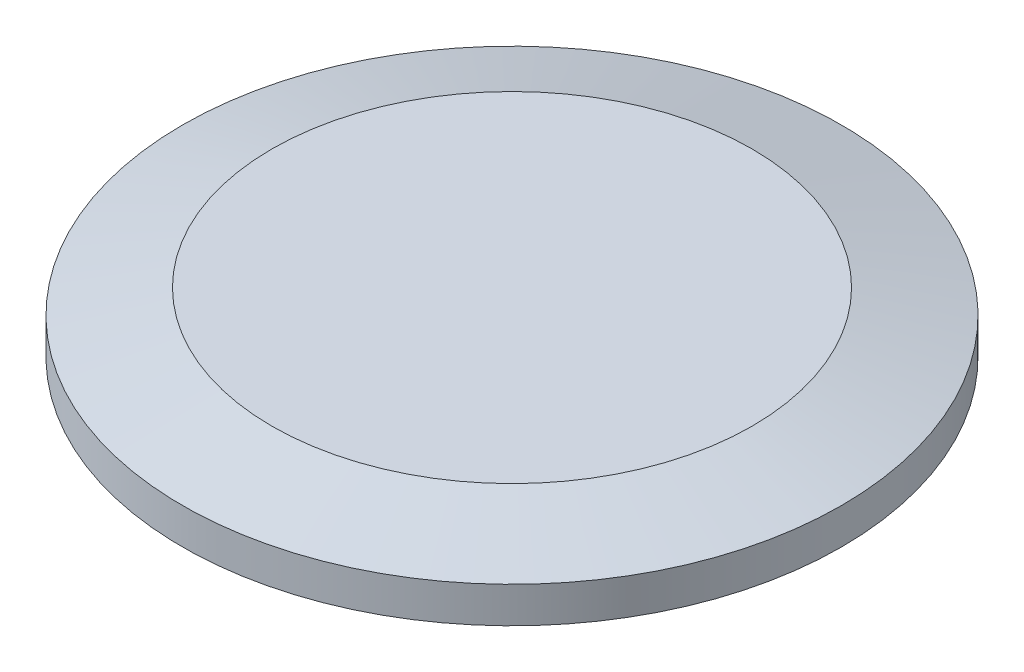
ISO-10303-21;
HEADER;
FILE_DESCRIPTION(('STEP AP214'),'2;1');
FILE_NAME('part.step','',(''),(''),'','','');
FILE_SCHEMA(('AUTOMOTIVE_DESIGN { 1 0 10303 214 1 1 1 1 }'));
ENDSEC;
DATA;
#1=APPLICATION_CONTEXT('core data for automotive mechanical design processes');
#2=APPLICATION_PROTOCOL_DEFINITION('international standard','automotive_design',2000,#1);
#3=PRODUCT_CONTEXT('',#1,'mechanical');
#4=PRODUCT('Part','Part','',(#3));
#5=PRODUCT_RELATED_PRODUCT_CATEGORY('part','',(#4));
#6=PRODUCT_DEFINITION_FORMATION('','',#4);
#7=PRODUCT_DEFINITION_CONTEXT('part definition',#1,'design');
#8=PRODUCT_DEFINITION('design','',#6,#7);
#9=PRODUCT_DEFINITION_SHAPE('','',#8);
#10=(LENGTH_UNIT() NAMED_UNIT(*) SI_UNIT(.MILLI.,.METRE.));
#11=(NAMED_UNIT(*) PLANE_ANGLE_UNIT() SI_UNIT($,.RADIAN.));
#12=(NAMED_UNIT(*) SI_UNIT($,.STERADIAN.) SOLID_ANGLE_UNIT());
#13=UNCERTAINTY_MEASURE_WITH_UNIT(LENGTH_MEASURE(1.E-05),#10,'distance_accuracy_value','');
#14=(GEOMETRIC_REPRESENTATION_CONTEXT(3) GLOBAL_UNCERTAINTY_ASSIGNED_CONTEXT((#13)) GLOBAL_UNIT_ASSIGNED_CONTEXT((#10,
#11,#12)) REPRESENTATION_CONTEXT('',''));
#15=CARTESIAN_POINT('',(0.,0.,0.));
#16=DIRECTION('',(0.,0.,1.));
#17=DIRECTION('',(1.,0.,0.));
#18=AXIS2_PLACEMENT_3D('',#15,#16,#17);
#19=CARTESIAN_POINT('',(0.,-5.,0.));
#20=DIRECTION('',(0.,-1.,0.));
#21=DIRECTION('',(0.,0.,-1.));
#22=AXIS2_PLACEMENT_3D('',#19,#20,#21);
#23=PLANE('',#22);
#24=CARTESIAN_POINT('',(0.,-5.,0.));
#25=DIRECTION('',(0.,1.,0.));
#26=DIRECTION('',(-1.,0.,0.));
#27=AXIS2_PLACEMENT_3D('',#24,#25,#26);
#28=CIRCLE('',#27,15.9);
#29=CARTESIAN_POINT('',(15.9,-5.,0.));
#30=VERTEX_POINT('',#29);
#31=EDGE_CURVE('E28',#30,#30,#28,.T.);
#32=ORIENTED_EDGE('',*,*,#31,.F.);
#33=EDGE_LOOP('',(#32));
#34=FACE_BOUND('',#33,.T.);
#35=ADVANCED_FACE('F17',(#34),#23,.T.);
#36=CARTESIAN_POINT('',(0.,0.25,0.));
#37=DIRECTION('',(0.,-1.,0.));
#38=DIRECTION('',(-1.,0.,0.));
#39=AXIS2_PLACEMENT_3D('',#36,#37,#38);
#40=CYLINDRICAL_SURFACE('',#39,15.9);
#41=ORIENTED_EDGE('',*,*,#31,.T.);
#42=DIRECTION('',(0.,1.,0.));
#43=VECTOR('',#42,1.);
#44=CARTESIAN_POINT('',(15.9,0.25,0.));
#45=LINE('',#44,#43);
#46=CARTESIAN_POINT('',(15.9,-2.,0.));
#47=VERTEX_POINT('',#46);
#48=EDGE_CURVE('E11',#30,#47,#45,.T.);
#49=ORIENTED_EDGE('',*,*,#48,.T.);
#50=CARTESIAN_POINT('',(0.,-2.,0.));
#51=DIRECTION('',(0.,-1.,0.));
#52=DIRECTION('',(-1.,0.,0.));
#53=AXIS2_PLACEMENT_3D('',#50,#51,#52);
#54=CIRCLE('',#53,15.9);
#55=EDGE_CURVE('E68',#47,#47,#54,.T.);
#56=ORIENTED_EDGE('',*,*,#55,.T.);
#57=ORIENTED_EDGE('',*,*,#48,.F.);
#58=EDGE_LOOP('',(#41,#49,#56,#57));
#59=FACE_BOUND('',#58,.T.);
#60=ADVANCED_FACE('F135',(#59),#40,.T.);
#61=CARTESIAN_POINT('',(0.,-2.,0.));
#62=DIRECTION('',(0.,-1.,0.));
#63=DIRECTION('',(0.,0.,-1.));
#64=AXIS2_PLACEMENT_3D('',#61,#62,#63);
#65=PLANE('',#64);
#66=ORIENTED_EDGE('',*,*,#55,.F.);
#67=EDGE_LOOP('',(#66));
#68=FACE_BOUND('',#67,.T.);
#69=CARTESIAN_POINT('',(0.,-2.,0.));
#70=DIRECTION('',(0.,1.,0.));
#71=DIRECTION('',(-1.,0.,0.));
#72=AXIS2_PLACEMENT_3D('',#69,#70,#71);
#73=CIRCLE('',#72,20.6);
#74=CARTESIAN_POINT('',(20.6,-2.,0.));
#75=VERTEX_POINT('',#74);
#76=EDGE_CURVE('E64',#75,#75,#73,.T.);
#77=ORIENTED_EDGE('',*,*,#76,.F.);
#78=EDGE_LOOP('',(#77));
#79=FACE_BOUND('',#78,.T.);
#80=ADVANCED_FACE('F130',(#68,#79),#65,.T.);
#81=CARTESIAN_POINT('',(0.,0.25,0.));
#82=DIRECTION('',(0.,-1.,0.));
#83=DIRECTION('',(-1.,0.,0.));
#84=AXIS2_PLACEMENT_3D('',#81,#82,#83);
#85=CYLINDRICAL_SURFACE('',#84,20.6);
#86=ORIENTED_EDGE('',*,*,#76,.T.);
#87=DIRECTION('',(0.,-1.,0.));
#88=VECTOR('',#87,1.);
#89=CARTESIAN_POINT('',(20.6,0.25,0.));
#90=LINE('',#89,#88);
#91=CARTESIAN_POINT('',(20.6,-5.,0.));
#92=VERTEX_POINT('',#91);
#93=EDGE_CURVE('E61',#75,#92,#90,.T.);
#94=ORIENTED_EDGE('',*,*,#93,.T.);
#95=CARTESIAN_POINT('',(0.,-5.,0.));
#96=DIRECTION('',(0.,-1.,0.));
#97=DIRECTION('',(-1.,0.,0.));
#98=AXIS2_PLACEMENT_3D('',#95,#96,#97);
#99=CIRCLE('',#98,20.6);
#100=EDGE_CURVE('E66',#92,#92,#99,.T.);
#101=ORIENTED_EDGE('',*,*,#100,.T.);
#102=ORIENTED_EDGE('',*,*,#93,.F.);
#103=EDGE_LOOP('',(#86,#94,#101,#102));
#104=FACE_BOUND('',#103,.T.);
#105=ADVANCED_FACE('F62',(#104),#85,.F.);
#106=CARTESIAN_POINT('',(0.,-5.,0.));
#107=DIRECTION('',(0.,-1.,0.));
#108=DIRECTION('',(0.,0.,-1.));
#109=AXIS2_PLACEMENT_3D('',#106,#107,#108);
#110=PLANE('',#109);
#111=ORIENTED_EDGE('',*,*,#100,.F.);
#112=EDGE_LOOP('',(#111));
#113=FACE_BOUND('',#112,.T.);
#114=CARTESIAN_POINT('',(0.,-5.,0.));
#115=DIRECTION('',(0.,1.,0.));
#116=DIRECTION('',(-1.,0.,0.));
#117=AXIS2_PLACEMENT_3D('',#114,#115,#116);
#118=CIRCLE('',#117,27.5);
#119=CARTESIAN_POINT('',(27.5,-5.,0.));
#120=VERTEX_POINT('',#119);
#121=EDGE_CURVE('E80',#120,#120,#118,.T.);
#122=ORIENTED_EDGE('',*,*,#121,.F.);
#123=EDGE_LOOP('',(#122));
#124=FACE_BOUND('',#123,.T.);
#125=ADVANCED_FACE('F19',(#113,#124),#110,.T.);
#126=CARTESIAN_POINT('',(0.,0.25,0.));
#127=DIRECTION('',(0.,-1.,0.));
#128=DIRECTION('',(-1.,0.,0.));
#129=AXIS2_PLACEMENT_3D('',#126,#127,#128);
#130=CYLINDRICAL_SURFACE('',#129,27.5);
#131=ORIENTED_EDGE('',*,*,#121,.T.);
#132=DIRECTION('',(0.,1.,0.));
#133=VECTOR('',#132,1.);
#134=CARTESIAN_POINT('',(27.5,0.25,0.));
#135=LINE('',#134,#133);
#136=CARTESIAN_POINT('',(27.5,-2.,0.));
#137=VERTEX_POINT('',#136);
#138=EDGE_CURVE('E84',#120,#137,#135,.T.);
#139=ORIENTED_EDGE('',*,*,#138,.T.);
#140=CARTESIAN_POINT('',(0.,-2.,0.));
#141=DIRECTION('',(0.,1.,0.));
#142=DIRECTION('',(-1.,0.,0.));
#143=AXIS2_PLACEMENT_3D('',#140,#141,#142);
#144=CIRCLE('',#143,27.5);
#145=EDGE_CURVE('E21',#137,#137,#144,.T.);
#146=ORIENTED_EDGE('',*,*,#145,.F.);
#147=ORIENTED_EDGE('',*,*,#138,.F.);
#148=EDGE_LOOP('',(#131,#139,#146,#147));
#149=FACE_BOUND('',#148,.T.);
#150=ADVANCED_FACE('F105',(#149),#130,.T.);
#151=CARTESIAN_POINT('',(0.,-1.,0.));
#152=DIRECTION('',(0.,-1.,0.));
#153=DIRECTION('',(-1.,0.,0.));
#154=AXIS2_PLACEMENT_3D('',#151,#152,#153);
#155=CONICAL_SURFACE('',#154,23.76794919243,1.30899693899575);
#156=ORIENTED_EDGE('',*,*,#145,.T.);
#157=DIRECTION('',(-0.965925826289068,0.258819045102521,0.));
#158=VECTOR('',#157,1.);
#159=CARTESIAN_POINT('',(23.76794919243,-1.,0.));
#160=LINE('',#159,#158);
#161=CARTESIAN_POINT('',(20.03589838486,0.,0.));
#162=VERTEX_POINT('',#161);
#163=EDGE_CURVE('E85',#137,#162,#160,.T.);
#164=ORIENTED_EDGE('',*,*,#163,.T.);
#165=CARTESIAN_POINT('',(0.,0.,0.));
#166=DIRECTION('',(0.,1.,0.));
#167=DIRECTION('',(-1.,0.,0.));
#168=AXIS2_PLACEMENT_3D('',#165,#166,#167);
#169=CIRCLE('',#168,20.03589838486);
#170=EDGE_CURVE('E88',#162,#162,#169,.T.);
#171=ORIENTED_EDGE('',*,*,#170,.F.);
#172=ORIENTED_EDGE('',*,*,#163,.F.);
#173=EDGE_LOOP('',(#156,#164,#171,#172));
#174=FACE_BOUND('',#173,.T.);
#175=ADVANCED_FACE('F102',(#174),#155,.T.);
#176=CARTESIAN_POINT('',(0.,0.,0.));
#177=DIRECTION('',(0.,-1.,0.));
#178=DIRECTION('',(0.,0.,-1.));
#179=AXIS2_PLACEMENT_3D('',#176,#177,#178);
#180=PLANE('',#179);
#181=ORIENTED_EDGE('',*,*,#170,.T.);
#182=EDGE_LOOP('',(#181));
#183=FACE_BOUND('',#182,.T.);
#184=ADVANCED_FACE('F163',(#183),#180,.F.);
#185=CLOSED_SHELL('',(#35,#60,#80,#105,#125,#150,#175,#184));
#186=MANIFOLD_SOLID_BREP('B1',#185);
#187=ADVANCED_BREP_SHAPE_REPRESENTATION('',(#18,#186),#14);
#188=SHAPE_DEFINITION_REPRESENTATION(#9,#187);
ENDSEC;
END-ISO-10303-21;
